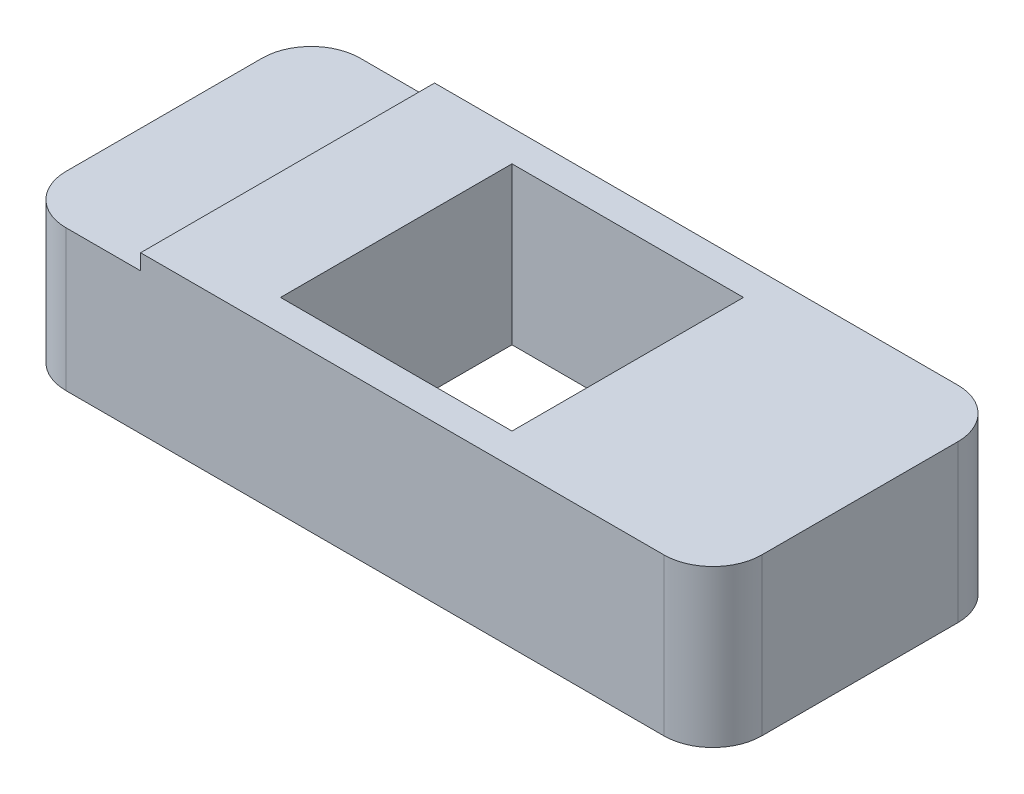
ISO-10303-21;
HEADER;
FILE_DESCRIPTION(('STEP AP214'),'2;1');
FILE_NAME('part.step','',(''),(''),'','','');
FILE_SCHEMA(('AUTOMOTIVE_DESIGN { 1 0 10303 214 1 1 1 1 }'));
ENDSEC;
DATA;
#1=APPLICATION_CONTEXT('core data for automotive mechanical design processes');
#2=APPLICATION_PROTOCOL_DEFINITION('international standard','automotive_design',2000,#1);
#3=PRODUCT_CONTEXT('',#1,'mechanical');
#4=PRODUCT('Part','Part','',(#3));
#5=PRODUCT_RELATED_PRODUCT_CATEGORY('part','',(#4));
#6=PRODUCT_DEFINITION_FORMATION('','',#4);
#7=PRODUCT_DEFINITION_CONTEXT('part definition',#1,'design');
#8=PRODUCT_DEFINITION('design','',#6,#7);
#9=PRODUCT_DEFINITION_SHAPE('','',#8);
#10=(LENGTH_UNIT() NAMED_UNIT(*) SI_UNIT(.MILLI.,.METRE.));
#11=(NAMED_UNIT(*) PLANE_ANGLE_UNIT() SI_UNIT($,.RADIAN.));
#12=(NAMED_UNIT(*) SI_UNIT($,.STERADIAN.) SOLID_ANGLE_UNIT());
#13=UNCERTAINTY_MEASURE_WITH_UNIT(LENGTH_MEASURE(1.E-05),#10,'distance_accuracy_value','');
#14=(GEOMETRIC_REPRESENTATION_CONTEXT(3) GLOBAL_UNCERTAINTY_ASSIGNED_CONTEXT((#13)) GLOBAL_UNIT_ASSIGNED_CONTEXT((#10,
#11,#12)) REPRESENTATION_CONTEXT('',''));
#15=CARTESIAN_POINT('',(0.,0.,0.));
#16=DIRECTION('',(0.,0.,1.));
#17=DIRECTION('',(1.,0.,0.));
#18=AXIS2_PLACEMENT_3D('',#15,#16,#17);
#19=CARTESIAN_POINT('',(-22.5425,-10.16,9.525));
#20=DIRECTION('',(0.,0.,1.));
#21=DIRECTION('',(1.,0.,0.));
#22=AXIS2_PLACEMENT_3D('',#19,#20,#21);
#23=PLANE('',#22);
#24=DIRECTION('',(1.,0.,0.));
#25=VECTOR('',#24,1.);
#26=CARTESIAN_POINT('',(-22.5425,0.,9.525));
#27=LINE('',#26,#25);
#28=CARTESIAN_POINT('',(-14.5425,0.,9.525));
#29=VERTEX_POINT('',#28);
#30=CARTESIAN_POINT('',(19.3675,0.,9.525));
#31=VERTEX_POINT('',#30);
#32=EDGE_CURVE('E369',#29,#31,#27,.T.);
#33=ORIENTED_EDGE('',*,*,#32,.F.);
#34=DIRECTION('',(0.,-1.,0.));
#35=VECTOR('',#34,1.);
#36=CARTESIAN_POINT('',(-14.5425,62.4848147177576,9.525));
#37=LINE('',#36,#35);
#38=CARTESIAN_POINT('',(-14.5425,-1.016,9.525));
#39=VERTEX_POINT('',#38);
#40=EDGE_CURVE('E317',#29,#39,#37,.T.);
#41=ORIENTED_EDGE('',*,*,#40,.T.);
#42=DIRECTION('',(1.,0.,0.));
#43=VECTOR('',#42,1.);
#44=CARTESIAN_POINT('',(-22.5425,-1.016,9.525));
#45=LINE('',#44,#43);
#46=CARTESIAN_POINT('',(-19.3675,-1.016,9.525));
#47=VERTEX_POINT('',#46);
#48=EDGE_CURVE('E255',#47,#39,#45,.T.);
#49=ORIENTED_EDGE('',*,*,#48,.F.);
#50=DIRECTION('',(0.,1.,0.));
#51=VECTOR('',#50,1.);
#52=CARTESIAN_POINT('',(-19.3675,-10.16,9.525));
#53=LINE('',#52,#51);
#54=CARTESIAN_POINT('',(-19.3675,-10.16,9.525));
#55=VERTEX_POINT('',#54);
#56=EDGE_CURVE('E378',#47,#55,#53,.F.);
#57=ORIENTED_EDGE('',*,*,#56,.T.);
#58=DIRECTION('',(1.,0.,0.));
#59=VECTOR('',#58,1.);
#60=CARTESIAN_POINT('',(-22.5425,-10.16,9.525));
#61=LINE('',#60,#59);
#62=CARTESIAN_POINT('',(19.3675,-10.16,9.525));
#63=VERTEX_POINT('',#62);
#64=EDGE_CURVE('E375',#55,#63,#61,.T.);
#65=ORIENTED_EDGE('',*,*,#64,.T.);
#66=DIRECTION('',(0.,1.,0.));
#67=VECTOR('',#66,1.);
#68=CARTESIAN_POINT('',(19.3675,-10.16,9.525));
#69=LINE('',#68,#67);
#70=EDGE_CURVE('E386',#63,#31,#69,.T.);
#71=ORIENTED_EDGE('',*,*,#70,.T.);
#72=EDGE_LOOP('',(#33,#41,#49,#57,#65,#71));
#73=FACE_BOUND('',#72,.T.);
#74=ADVANCED_FACE('F34',(#73),#23,.T.);
#75=CARTESIAN_POINT('',(-22.5425,-10.16,-9.525));
#76=DIRECTION('',(0.,0.,-1.));
#77=DIRECTION('',(-1.,0.,0.));
#78=AXIS2_PLACEMENT_3D('',#75,#76,#77);
#79=PLANE('',#78);
#80=DIRECTION('',(-1.,0.,0.));
#81=VECTOR('',#80,1.);
#82=CARTESIAN_POINT('',(-22.5425,-1.016,-9.525));
#83=LINE('',#82,#81);
#84=CARTESIAN_POINT('',(-14.5425,-1.016,-9.525));
#85=VERTEX_POINT('',#84);
#86=CARTESIAN_POINT('',(-19.3675,-1.016,-9.525));
#87=VERTEX_POINT('',#86);
#88=EDGE_CURVE('E322',#85,#87,#83,.T.);
#89=ORIENTED_EDGE('',*,*,#88,.F.);
#90=DIRECTION('',(0.,-1.,0.));
#91=VECTOR('',#90,1.);
#92=CARTESIAN_POINT('',(-14.5425,62.4848147177576,-9.525));
#93=LINE('',#92,#91);
#94=CARTESIAN_POINT('',(-14.5425,0.,-9.525));
#95=VERTEX_POINT('',#94);
#96=EDGE_CURVE('E311',#95,#85,#93,.T.);
#97=ORIENTED_EDGE('',*,*,#96,.F.);
#98=DIRECTION('',(-1.,0.,0.));
#99=VECTOR('',#98,1.);
#100=CARTESIAN_POINT('',(-22.5425,0.,-9.525));
#101=LINE('',#100,#99);
#102=CARTESIAN_POINT('',(19.3675,0.,-9.525));
#103=VERTEX_POINT('',#102);
#104=EDGE_CURVE('E381',#103,#95,#101,.T.);
#105=ORIENTED_EDGE('',*,*,#104,.F.);
#106=DIRECTION('',(0.,1.,0.));
#107=VECTOR('',#106,1.);
#108=CARTESIAN_POINT('',(19.3675,-10.16,-9.525));
#109=LINE('',#108,#107);
#110=CARTESIAN_POINT('',(19.3675,-10.16,-9.525));
#111=VERTEX_POINT('',#110);
#112=EDGE_CURVE('E409',#103,#111,#109,.F.);
#113=ORIENTED_EDGE('',*,*,#112,.T.);
#114=DIRECTION('',(-1.,0.,0.));
#115=VECTOR('',#114,1.);
#116=CARTESIAN_POINT('',(-22.5425,-10.16,-9.525));
#117=LINE('',#116,#115);
#118=CARTESIAN_POINT('',(-19.3675,-10.16,-9.525));
#119=VERTEX_POINT('',#118);
#120=EDGE_CURVE('E368',#111,#119,#117,.T.);
#121=ORIENTED_EDGE('',*,*,#120,.T.);
#122=DIRECTION('',(0.,1.,0.));
#123=VECTOR('',#122,1.);
#124=CARTESIAN_POINT('',(-19.3675,-10.16,-9.525));
#125=LINE('',#124,#123);
#126=EDGE_CURVE('E406',#119,#87,#125,.T.);
#127=ORIENTED_EDGE('',*,*,#126,.T.);
#128=EDGE_LOOP('',(#89,#97,#105,#113,#121,#127));
#129=FACE_BOUND('',#128,.T.);
#130=ADVANCED_FACE('F425',(#129),#79,.T.);
#131=CARTESIAN_POINT('',(0.,0.,0.));
#132=DIRECTION('',(0.,-1.,0.));
#133=DIRECTION('',(0.,0.,-1.));
#134=AXIS2_PLACEMENT_3D('',#131,#132,#133);
#135=PLANE('',#134);
#136=DIRECTION('',(-1.,0.,0.));
#137=VECTOR('',#136,1.);
#138=CARTESIAN_POINT('',(-7.5,0.,-7.5));
#139=LINE('',#138,#137);
#140=CARTESIAN_POINT('',(7.5,0.,-7.5));
#141=VERTEX_POINT('',#140);
#142=CARTESIAN_POINT('',(-7.5,0.,-7.5));
#143=VERTEX_POINT('',#142);
#144=EDGE_CURVE('E348',#141,#143,#139,.T.);
#145=ORIENTED_EDGE('',*,*,#144,.F.);
#146=DIRECTION('',(0.,0.,-1.));
#147=VECTOR('',#146,1.);
#148=CARTESIAN_POINT('',(7.5,0.,7.5));
#149=LINE('',#148,#147);
#150=CARTESIAN_POINT('',(7.5,0.,7.5));
#151=VERTEX_POINT('',#150);
#152=EDGE_CURVE('E319',#151,#141,#149,.T.);
#153=ORIENTED_EDGE('',*,*,#152,.F.);
#154=DIRECTION('',(1.,0.,0.));
#155=VECTOR('',#154,1.);
#156=CARTESIAN_POINT('',(-7.5,0.,7.5));
#157=LINE('',#156,#155);
#158=CARTESIAN_POINT('',(-7.5,0.,7.5));
#159=VERTEX_POINT('',#158);
#160=EDGE_CURVE('E337',#159,#151,#157,.T.);
#161=ORIENTED_EDGE('',*,*,#160,.F.);
#162=DIRECTION('',(0.,0.,1.));
#163=VECTOR('',#162,1.);
#164=CARTESIAN_POINT('',(-7.5,0.,7.5));
#165=LINE('',#164,#163);
#166=EDGE_CURVE('E351',#143,#159,#165,.T.);
#167=ORIENTED_EDGE('',*,*,#166,.F.);
#168=EDGE_LOOP('',(#145,#153,#161,#167));
#169=FACE_BOUND('',#168,.T.);
#170=DIRECTION('',(0.,0.,1.));
#171=VECTOR('',#170,1.);
#172=CARTESIAN_POINT('',(-14.5425,0.,9.525));
#173=LINE('',#172,#171);
#174=EDGE_CURVE('E312',#95,#29,#173,.T.);
#175=ORIENTED_EDGE('',*,*,#174,.T.);
#176=ORIENTED_EDGE('',*,*,#32,.T.);
#177=CARTESIAN_POINT('',(19.3675,0.,6.35));
#178=DIRECTION('',(0.,-1.,0.));
#179=DIRECTION('',(0.,0.,-1.));
#180=AXIS2_PLACEMENT_3D('',#177,#178,#179);
#181=CIRCLE('',#180,3.175);
#182=CARTESIAN_POINT('',(22.5425,0.,6.35));
#183=VERTEX_POINT('',#182);
#184=EDGE_CURVE('E391',#31,#183,#181,.F.);
#185=ORIENTED_EDGE('',*,*,#184,.T.);
#186=DIRECTION('',(0.,0.,-1.));
#187=VECTOR('',#186,1.);
#188=CARTESIAN_POINT('',(22.5425,0.,9.525));
#189=LINE('',#188,#187);
#190=CARTESIAN_POINT('',(22.5425,0.,-6.34999999999999));
#191=VERTEX_POINT('',#190);
#192=EDGE_CURVE('E358',#183,#191,#189,.T.);
#193=ORIENTED_EDGE('',*,*,#192,.T.);
#194=CARTESIAN_POINT('',(19.3675,0.,-6.35));
#195=DIRECTION('',(0.,-1.,0.));
#196=DIRECTION('',(0.,0.,-1.));
#197=AXIS2_PLACEMENT_3D('',#194,#195,#196);
#198=CIRCLE('',#197,3.175);
#199=EDGE_CURVE('E389',#191,#103,#198,.F.);
#200=ORIENTED_EDGE('',*,*,#199,.T.);
#201=ORIENTED_EDGE('',*,*,#104,.T.);
#202=EDGE_LOOP('',(#175,#176,#185,#193,#200,#201));
#203=FACE_BOUND('',#202,.T.);
#204=ADVANCED_FACE('F436',(#169,#203),#135,.F.);
#205=CARTESIAN_POINT('',(22.5425,-10.16,9.525));
#206=DIRECTION('',(1.,0.,0.));
#207=DIRECTION('',(0.,0.,-1.));
#208=AXIS2_PLACEMENT_3D('',#205,#206,#207);
#209=PLANE('',#208);
#210=ORIENTED_EDGE('',*,*,#192,.F.);
#211=DIRECTION('',(0.,1.,0.));
#212=VECTOR('',#211,1.);
#213=CARTESIAN_POINT('',(22.5425,-10.16,6.35));
#214=LINE('',#213,#212);
#215=CARTESIAN_POINT('',(22.5425,-10.16,6.35));
#216=VERTEX_POINT('',#215);
#217=EDGE_CURVE('E396',#183,#216,#214,.F.);
#218=ORIENTED_EDGE('',*,*,#217,.T.);
#219=DIRECTION('',(0.,0.,-1.));
#220=VECTOR('',#219,1.);
#221=CARTESIAN_POINT('',(22.5425,-10.16,9.525));
#222=LINE('',#221,#220);
#223=CARTESIAN_POINT('',(22.5425,-10.16,-6.34999999999999));
#224=VERTEX_POINT('',#223);
#225=EDGE_CURVE('E365',#216,#224,#222,.T.);
#226=ORIENTED_EDGE('',*,*,#225,.T.);
#227=DIRECTION('',(0.,1.,0.));
#228=VECTOR('',#227,1.);
#229=CARTESIAN_POINT('',(22.5425,-10.16,-6.35));
#230=LINE('',#229,#228);
#231=EDGE_CURVE('E393',#224,#191,#230,.T.);
#232=ORIENTED_EDGE('',*,*,#231,.T.);
#233=EDGE_LOOP('',(#210,#218,#226,#232));
#234=FACE_BOUND('',#233,.T.);
#235=ADVANCED_FACE('F444',(#234),#209,.T.);
#236=CARTESIAN_POINT('',(-22.5425,-10.16,9.525));
#237=DIRECTION('',(-1.,0.,0.));
#238=DIRECTION('',(0.,0.,1.));
#239=AXIS2_PLACEMENT_3D('',#236,#237,#238);
#240=PLANE('',#239);
#241=DIRECTION('',(0.,0.,1.));
#242=VECTOR('',#241,1.);
#243=CARTESIAN_POINT('',(-22.5425,-1.016,9.525));
#244=LINE('',#243,#242);
#245=CARTESIAN_POINT('',(-22.5425,-1.016,-6.34999999999999));
#246=VERTEX_POINT('',#245);
#247=CARTESIAN_POINT('',(-22.5425,-1.016,6.35));
#248=VERTEX_POINT('',#247);
#249=EDGE_CURVE('E328',#246,#248,#244,.T.);
#250=ORIENTED_EDGE('',*,*,#249,.F.);
#251=DIRECTION('',(0.,1.,0.));
#252=VECTOR('',#251,1.);
#253=CARTESIAN_POINT('',(-22.5425,-10.16,-6.35));
#254=LINE('',#253,#252);
#255=CARTESIAN_POINT('',(-22.5425,-10.16,-6.34999999999999));
#256=VERTEX_POINT('',#255);
#257=EDGE_CURVE('E42',#246,#256,#254,.F.);
#258=ORIENTED_EDGE('',*,*,#257,.T.);
#259=DIRECTION('',(0.,0.,1.));
#260=VECTOR('',#259,1.);
#261=CARTESIAN_POINT('',(-22.5425,-10.16,9.525));
#262=LINE('',#261,#260);
#263=CARTESIAN_POINT('',(-22.5425,-10.16,6.35));
#264=VERTEX_POINT('',#263);
#265=EDGE_CURVE('E372',#256,#264,#262,.T.);
#266=ORIENTED_EDGE('',*,*,#265,.T.);
#267=DIRECTION('',(0.,1.,0.));
#268=VECTOR('',#267,1.);
#269=CARTESIAN_POINT('',(-22.5425,-10.16,6.35));
#270=LINE('',#269,#268);
#271=EDGE_CURVE('E11',#264,#248,#270,.T.);
#272=ORIENTED_EDGE('',*,*,#271,.T.);
#273=EDGE_LOOP('',(#250,#258,#266,#272));
#274=FACE_BOUND('',#273,.T.);
#275=ADVANCED_FACE('F413',(#274),#240,.T.);
#276=CARTESIAN_POINT('',(0.,-10.16,0.));
#277=DIRECTION('',(0.,-1.,0.));
#278=DIRECTION('',(0.,0.,-1.));
#279=AXIS2_PLACEMENT_3D('',#276,#277,#278);
#280=PLANE('',#279);
#281=DIRECTION('',(0.,0.,-1.));
#282=VECTOR('',#281,1.);
#283=CARTESIAN_POINT('',(-21.216,-10.16,3.66617420935412));
#284=LINE('',#283,#282);
#285=CARTESIAN_POINT('',(-21.216,-10.16,3.66617420935412));
#286=VERTEX_POINT('',#285);
#287=CARTESIAN_POINT('',(-21.216,-10.16,-3.66617420935412));
#288=VERTEX_POINT('',#287);
#289=EDGE_CURVE('E49',#286,#288,#284,.T.);
#290=ORIENTED_EDGE('',*,*,#289,.F.);
#291=DIRECTION('',(-0.866025403784439,0.,-0.5));
#292=VECTOR('',#291,1.);
#293=CARTESIAN_POINT('',(-14.866,-10.16,7.33234841870825));
#294=LINE('',#293,#292);
#295=CARTESIAN_POINT('',(-14.866,-10.16,7.33234841870825));
#296=VERTEX_POINT('',#295);
#297=EDGE_CURVE('E228',#296,#286,#294,.T.);
#298=ORIENTED_EDGE('',*,*,#297,.F.);
#299=DIRECTION('',(-0.866025403784439,0.,0.5));
#300=VECTOR('',#299,1.);
#301=CARTESIAN_POINT('',(-8.516,-10.16,3.66617420935412));
#302=LINE('',#301,#300);
#303=CARTESIAN_POINT('',(-8.516,-10.16,3.66617420935412));
#304=VERTEX_POINT('',#303);
#305=EDGE_CURVE('E231',#304,#296,#302,.T.);
#306=ORIENTED_EDGE('',*,*,#305,.F.);
#307=DIRECTION('',(0.,0.,1.));
#308=VECTOR('',#307,1.);
#309=CARTESIAN_POINT('',(-8.516,-10.16,-3.66617420935412));
#310=LINE('',#309,#308);
#311=CARTESIAN_POINT('',(-8.516,-10.16,-3.66617420935412));
#312=VERTEX_POINT('',#311);
#313=EDGE_CURVE('E248',#312,#304,#310,.T.);
#314=ORIENTED_EDGE('',*,*,#313,.F.);
#315=DIRECTION('',(0.866025403784439,0.,0.5));
#316=VECTOR('',#315,1.);
#317=CARTESIAN_POINT('',(-14.866,-10.16,-7.33234841870824));
#318=LINE('',#317,#316);
#319=CARTESIAN_POINT('',(-14.866,-10.16,-7.33234841870824));
#320=VERTEX_POINT('',#319);
#321=EDGE_CURVE('E245',#320,#312,#318,.T.);
#322=ORIENTED_EDGE('',*,*,#321,.F.);
#323=DIRECTION('',(0.866025403784439,0.,-0.5));
#324=VECTOR('',#323,1.);
#325=CARTESIAN_POINT('',(-21.216,-10.16,-3.66617420935412));
#326=LINE('',#325,#324);
#327=EDGE_CURVE('E242',#288,#320,#326,.T.);
#328=ORIENTED_EDGE('',*,*,#327,.F.);
#329=EDGE_LOOP('',(#290,#298,#306,#314,#322,#328));
#330=FACE_BOUND('',#329,.T.);
#331=DIRECTION('',(0.,0.,-1.));
#332=VECTOR('',#331,1.);
#333=CARTESIAN_POINT('',(8.516,-10.16,3.66617420935412));
#334=LINE('',#333,#332);
#335=CARTESIAN_POINT('',(8.516,-10.16,3.66617420935412));
#336=VERTEX_POINT('',#335);
#337=CARTESIAN_POINT('',(8.516,-10.16,-3.66617420935413));
#338=VERTEX_POINT('',#337);
#339=EDGE_CURVE('E57',#336,#338,#334,.T.);
#340=ORIENTED_EDGE('',*,*,#339,.F.);
#341=DIRECTION('',(-0.866025403784439,0.,-0.5));
#342=VECTOR('',#341,1.);
#343=CARTESIAN_POINT('',(14.866,-10.16,7.33234841870825));
#344=LINE('',#343,#342);
#345=CARTESIAN_POINT('',(14.866,-10.16,7.33234841870825));
#346=VERTEX_POINT('',#345);
#347=EDGE_CURVE('E267',#346,#336,#344,.T.);
#348=ORIENTED_EDGE('',*,*,#347,.F.);
#349=DIRECTION('',(-0.866025403784439,0.,0.5));
#350=VECTOR('',#349,1.);
#351=CARTESIAN_POINT('',(21.216,-10.16,3.66617420935412));
#352=LINE('',#351,#350);
#353=CARTESIAN_POINT('',(21.216,-10.16,3.66617420935412));
#354=VERTEX_POINT('',#353);
#355=EDGE_CURVE('E293',#354,#346,#352,.T.);
#356=ORIENTED_EDGE('',*,*,#355,.F.);
#357=DIRECTION('',(0.,0.,1.));
#358=VECTOR('',#357,1.);
#359=CARTESIAN_POINT('',(21.216,-10.16,-3.66617420935413));
#360=LINE('',#359,#358);
#361=CARTESIAN_POINT('',(21.216,-10.16,-3.66617420935413));
#362=VERTEX_POINT('',#361);
#363=EDGE_CURVE('E290',#362,#354,#360,.T.);
#364=ORIENTED_EDGE('',*,*,#363,.F.);
#365=DIRECTION('',(0.866025403784439,0.,0.5));
#366=VECTOR('',#365,1.);
#367=CARTESIAN_POINT('',(14.866,-10.16,-7.33234841870825));
#368=LINE('',#367,#366);
#369=CARTESIAN_POINT('',(14.866,-10.16,-7.33234841870825));
#370=VERTEX_POINT('',#369);
#371=EDGE_CURVE('E287',#370,#362,#368,.T.);
#372=ORIENTED_EDGE('',*,*,#371,.F.);
#373=DIRECTION('',(0.866025403784439,0.,-0.5));
#374=VECTOR('',#373,1.);
#375=CARTESIAN_POINT('',(8.516,-10.16,-3.66617420935412));
#376=LINE('',#375,#374);
#377=EDGE_CURVE('E284',#338,#370,#376,.T.);
#378=ORIENTED_EDGE('',*,*,#377,.F.);
#379=EDGE_LOOP('',(#340,#348,#356,#364,#372,#378));
#380=FACE_BOUND('',#379,.T.);
#381=DIRECTION('',(0.,0.,-1.));
#382=VECTOR('',#381,1.);
#383=CARTESIAN_POINT('',(7.5,-10.16,7.5));
#384=LINE('',#383,#382);
#385=CARTESIAN_POINT('',(7.5,-10.16,7.5));
#386=VERTEX_POINT('',#385);
#387=CARTESIAN_POINT('',(7.5,-10.16,-7.5));
#388=VERTEX_POINT('',#387);
#389=EDGE_CURVE('E333',#386,#388,#384,.T.);
#390=ORIENTED_EDGE('',*,*,#389,.T.);
#391=DIRECTION('',(-1.,0.,0.));
#392=VECTOR('',#391,1.);
#393=CARTESIAN_POINT('',(-7.5,-10.16,-7.5));
#394=LINE('',#393,#392);
#395=CARTESIAN_POINT('',(-7.5,-10.16,-7.5));
#396=VERTEX_POINT('',#395);
#397=EDGE_CURVE('E336',#388,#396,#394,.T.);
#398=ORIENTED_EDGE('',*,*,#397,.T.);
#399=DIRECTION('',(0.,0.,1.));
#400=VECTOR('',#399,1.);
#401=CARTESIAN_POINT('',(-7.5,-10.16,7.5));
#402=LINE('',#401,#400);
#403=CARTESIAN_POINT('',(-7.5,-10.16,7.5));
#404=VERTEX_POINT('',#403);
#405=EDGE_CURVE('E340',#396,#404,#402,.T.);
#406=ORIENTED_EDGE('',*,*,#405,.T.);
#407=DIRECTION('',(1.,0.,0.));
#408=VECTOR('',#407,1.);
#409=CARTESIAN_POINT('',(-7.5,-10.16,7.5));
#410=LINE('',#409,#408);
#411=EDGE_CURVE('E343',#404,#386,#410,.T.);
#412=ORIENTED_EDGE('',*,*,#411,.T.);
#413=EDGE_LOOP('',(#390,#398,#406,#412));
#414=FACE_BOUND('',#413,.T.);
#415=ORIENTED_EDGE('',*,*,#225,.F.);
#416=CARTESIAN_POINT('',(19.3675,-10.16,6.35));
#417=DIRECTION('',(0.,-1.,0.));
#418=DIRECTION('',(0.,0.,-1.));
#419=AXIS2_PLACEMENT_3D('',#416,#417,#418);
#420=CIRCLE('',#419,3.175);
#421=EDGE_CURVE('E404',#216,#63,#420,.T.);
#422=ORIENTED_EDGE('',*,*,#421,.T.);
#423=ORIENTED_EDGE('',*,*,#64,.F.);
#424=CARTESIAN_POINT('',(-19.3675,-10.16,6.35));
#425=DIRECTION('',(0.,-1.,0.));
#426=DIRECTION('',(0.,0.,-1.));
#427=AXIS2_PLACEMENT_3D('',#424,#425,#426);
#428=CIRCLE('',#427,3.175);
#429=EDGE_CURVE('E400',#55,#264,#428,.T.);
#430=ORIENTED_EDGE('',*,*,#429,.T.);
#431=ORIENTED_EDGE('',*,*,#265,.F.);
#432=CARTESIAN_POINT('',(-19.3675,-10.16,-6.35));
#433=DIRECTION('',(0.,-1.,0.));
#434=DIRECTION('',(0.,0.,-1.));
#435=AXIS2_PLACEMENT_3D('',#432,#433,#434);
#436=CIRCLE('',#435,3.175);
#437=EDGE_CURVE('E398',#256,#119,#436,.T.);
#438=ORIENTED_EDGE('',*,*,#437,.T.);
#439=ORIENTED_EDGE('',*,*,#120,.F.);
#440=CARTESIAN_POINT('',(19.3675,-10.16,-6.35));
#441=DIRECTION('',(0.,-1.,0.));
#442=DIRECTION('',(0.,0.,-1.));
#443=AXIS2_PLACEMENT_3D('',#440,#441,#442);
#444=CIRCLE('',#443,3.175);
#445=EDGE_CURVE('E402',#111,#224,#444,.T.);
#446=ORIENTED_EDGE('',*,*,#445,.T.);
#447=EDGE_LOOP('',(#415,#422,#423,#430,#431,#438,#439,#446));
#448=FACE_BOUND('',#447,.T.);
#449=ADVANCED_FACE('F419',(#330,#380,#414,#448),#280,.T.);
#450=CARTESIAN_POINT('',(7.5,-10.16,7.5));
#451=DIRECTION('',(1.,0.,0.));
#452=DIRECTION('',(0.,0.,-1.));
#453=AXIS2_PLACEMENT_3D('',#450,#451,#452);
#454=PLANE('',#453);
#455=ORIENTED_EDGE('',*,*,#152,.T.);
#456=DIRECTION('',(0.,1.,0.));
#457=VECTOR('',#456,1.);
#458=CARTESIAN_POINT('',(7.5,-10.16,-7.5));
#459=LINE('',#458,#457);
#460=EDGE_CURVE('E346',#388,#141,#459,.T.);
#461=ORIENTED_EDGE('',*,*,#460,.F.);
#462=ORIENTED_EDGE('',*,*,#389,.F.);
#463=DIRECTION('',(0.,1.,0.));
#464=VECTOR('',#463,1.);
#465=CARTESIAN_POINT('',(7.5,-10.16,7.5));
#466=LINE('',#465,#464);
#467=EDGE_CURVE('E356',#386,#151,#466,.T.);
#468=ORIENTED_EDGE('',*,*,#467,.T.);
#469=EDGE_LOOP('',(#455,#461,#462,#468));
#470=FACE_BOUND('',#469,.T.);
#471=ADVANCED_FACE('F490',(#470),#454,.F.);
#472=CARTESIAN_POINT('',(-7.5,-10.16,7.5));
#473=DIRECTION('',(0.,0.,1.));
#474=DIRECTION('',(1.,0.,0.));
#475=AXIS2_PLACEMENT_3D('',#472,#473,#474);
#476=PLANE('',#475);
#477=ORIENTED_EDGE('',*,*,#160,.T.);
#478=ORIENTED_EDGE('',*,*,#467,.F.);
#479=ORIENTED_EDGE('',*,*,#411,.F.);
#480=DIRECTION('',(0.,1.,0.));
#481=VECTOR('',#480,1.);
#482=CARTESIAN_POINT('',(-7.5,-10.16,7.5));
#483=LINE('',#482,#481);
#484=EDGE_CURVE('E359',#404,#159,#483,.T.);
#485=ORIENTED_EDGE('',*,*,#484,.T.);
#486=EDGE_LOOP('',(#477,#478,#479,#485));
#487=FACE_BOUND('',#486,.T.);
#488=ADVANCED_FACE('F485',(#487),#476,.F.);
#489=CARTESIAN_POINT('',(-7.5,-10.16,7.5));
#490=DIRECTION('',(-1.,0.,0.));
#491=DIRECTION('',(0.,0.,1.));
#492=AXIS2_PLACEMENT_3D('',#489,#490,#491);
#493=PLANE('',#492);
#494=ORIENTED_EDGE('',*,*,#166,.T.);
#495=ORIENTED_EDGE('',*,*,#484,.F.);
#496=ORIENTED_EDGE('',*,*,#405,.F.);
#497=DIRECTION('',(0.,1.,0.));
#498=VECTOR('',#497,1.);
#499=CARTESIAN_POINT('',(-7.5,-10.16,-7.5));
#500=LINE('',#499,#498);
#501=EDGE_CURVE('E361',#396,#143,#500,.T.);
#502=ORIENTED_EDGE('',*,*,#501,.T.);
#503=EDGE_LOOP('',(#494,#495,#496,#502));
#504=FACE_BOUND('',#503,.T.);
#505=ADVANCED_FACE('F479',(#504),#493,.F.);
#506=CARTESIAN_POINT('',(-7.5,-10.16,-7.5));
#507=DIRECTION('',(0.,0.,-1.));
#508=DIRECTION('',(-1.,0.,0.));
#509=AXIS2_PLACEMENT_3D('',#506,#507,#508);
#510=PLANE('',#509);
#511=ORIENTED_EDGE('',*,*,#144,.T.);
#512=ORIENTED_EDGE('',*,*,#501,.F.);
#513=ORIENTED_EDGE('',*,*,#397,.F.);
#514=ORIENTED_EDGE('',*,*,#460,.T.);
#515=EDGE_LOOP('',(#511,#512,#513,#514));
#516=FACE_BOUND('',#515,.T.);
#517=ADVANCED_FACE('F475',(#516),#510,.F.);
#518=CARTESIAN_POINT('',(19.3675,-10.16,6.35));
#519=DIRECTION('',(0.,1.,0.));
#520=DIRECTION('',(0.,0.,1.));
#521=AXIS2_PLACEMENT_3D('',#518,#519,#520);
#522=CYLINDRICAL_SURFACE('',#521,3.175);
#523=ORIENTED_EDGE('',*,*,#421,.F.);
#524=ORIENTED_EDGE('',*,*,#217,.F.);
#525=ORIENTED_EDGE('',*,*,#184,.F.);
#526=ORIENTED_EDGE('',*,*,#70,.F.);
#527=EDGE_LOOP('',(#523,#524,#525,#526));
#528=FACE_BOUND('',#527,.T.);
#529=ADVANCED_FACE('F449',(#528),#522,.T.);
#530=CARTESIAN_POINT('',(19.3675,-10.16,-6.35));
#531=DIRECTION('',(0.,1.,0.));
#532=DIRECTION('',(0.,0.,1.));
#533=AXIS2_PLACEMENT_3D('',#530,#531,#532);
#534=CYLINDRICAL_SURFACE('',#533,3.175);
#535=ORIENTED_EDGE('',*,*,#445,.F.);
#536=ORIENTED_EDGE('',*,*,#112,.F.);
#537=ORIENTED_EDGE('',*,*,#199,.F.);
#538=ORIENTED_EDGE('',*,*,#231,.F.);
#539=EDGE_LOOP('',(#535,#536,#537,#538));
#540=FACE_BOUND('',#539,.T.);
#541=ADVANCED_FACE('F442',(#540),#534,.T.);
#542=CARTESIAN_POINT('',(-19.3675,-10.16,6.35));
#543=DIRECTION('',(0.,1.,0.));
#544=DIRECTION('',(0.,0.,1.));
#545=AXIS2_PLACEMENT_3D('',#542,#543,#544);
#546=CYLINDRICAL_SURFACE('',#545,3.175);
#547=CARTESIAN_POINT('',(-19.3675,-1.016,6.35));
#548=DIRECTION('',(0.,-1.,0.));
#549=DIRECTION('',(0.,0.,-1.));
#550=AXIS2_PLACEMENT_3D('',#547,#548,#549);
#551=CIRCLE('',#550,3.175);
#552=EDGE_CURVE('E314',#248,#47,#551,.F.);
#553=ORIENTED_EDGE('',*,*,#552,.F.);
#554=ORIENTED_EDGE('',*,*,#271,.F.);
#555=ORIENTED_EDGE('',*,*,#429,.F.);
#556=ORIENTED_EDGE('',*,*,#56,.F.);
#557=EDGE_LOOP('',(#553,#554,#555,#556));
#558=FACE_BOUND('',#557,.T.);
#559=ADVANCED_FACE('F454',(#558),#546,.T.);
#560=CARTESIAN_POINT('',(-19.3675,-10.16,-6.35));
#561=DIRECTION('',(0.,1.,0.));
#562=DIRECTION('',(0.,0.,1.));
#563=AXIS2_PLACEMENT_3D('',#560,#561,#562);
#564=CYLINDRICAL_SURFACE('',#563,3.175);
#565=CARTESIAN_POINT('',(-19.3675,-1.016,-6.35));
#566=DIRECTION('',(0.,-1.,0.));
#567=DIRECTION('',(0.,0.,-1.));
#568=AXIS2_PLACEMENT_3D('',#565,#566,#567);
#569=CIRCLE('',#568,3.175);
#570=EDGE_CURVE('E325',#87,#246,#569,.F.);
#571=ORIENTED_EDGE('',*,*,#570,.F.);
#572=ORIENTED_EDGE('',*,*,#126,.F.);
#573=ORIENTED_EDGE('',*,*,#437,.F.);
#574=ORIENTED_EDGE('',*,*,#257,.F.);
#575=EDGE_LOOP('',(#571,#572,#573,#574));
#576=FACE_BOUND('',#575,.T.);
#577=ADVANCED_FACE('F36',(#576),#564,.T.);
#578=CARTESIAN_POINT('',(-14.5425,62.4848147177576,9.525));
#579=DIRECTION('',(-1.,0.,0.));
#580=DIRECTION('',(0.,0.,1.));
#581=AXIS2_PLACEMENT_3D('',#578,#579,#580);
#582=PLANE('',#581);
#583=ORIENTED_EDGE('',*,*,#174,.F.);
#584=ORIENTED_EDGE('',*,*,#96,.T.);
#585=DIRECTION('',(0.,0.,1.));
#586=VECTOR('',#585,1.);
#587=CARTESIAN_POINT('',(-14.5425,-1.016,9.525));
#588=LINE('',#587,#586);
#589=EDGE_CURVE('E308',#85,#39,#588,.T.);
#590=ORIENTED_EDGE('',*,*,#589,.T.);
#591=ORIENTED_EDGE('',*,*,#40,.F.);
#592=EDGE_LOOP('',(#583,#584,#590,#591));
#593=FACE_BOUND('',#592,.T.);
#594=ADVANCED_FACE('F432',(#593),#582,.T.);
#595=CARTESIAN_POINT('',(0.,-1.016,0.));
#596=DIRECTION('',(0.,-1.,0.));
#597=DIRECTION('',(0.,0.,-1.));
#598=AXIS2_PLACEMENT_3D('',#595,#596,#597);
#599=PLANE('',#598);
#600=ORIENTED_EDGE('',*,*,#48,.T.);
#601=ORIENTED_EDGE('',*,*,#589,.F.);
#602=ORIENTED_EDGE('',*,*,#88,.T.);
#603=ORIENTED_EDGE('',*,*,#570,.T.);
#604=ORIENTED_EDGE('',*,*,#249,.T.);
#605=ORIENTED_EDGE('',*,*,#552,.T.);
#606=EDGE_LOOP('',(#600,#601,#602,#603,#604,#605));
#607=FACE_BOUND('',#606,.T.);
#608=ADVANCED_FACE('F428',(#607),#599,.F.);
#609=CARTESIAN_POINT('',(8.516,-1.524,3.66617420935412));
#610=DIRECTION('',(-1.,0.,0.));
#611=DIRECTION('',(0.,0.,1.));
#612=AXIS2_PLACEMENT_3D('',#609,#610,#611);
#613=PLANE('',#612);
#614=ORIENTED_EDGE('',*,*,#339,.T.);
#615=DIRECTION('',(0.,-1.,0.));
#616=VECTOR('',#615,1.);
#617=CARTESIAN_POINT('',(8.516,-1.524,-3.66617420935412));
#618=LINE('',#617,#616);
#619=CARTESIAN_POINT('',(8.516,-1.524,-3.66617420935412));
#620=VERTEX_POINT('',#619);
#621=EDGE_CURVE('E282',#620,#338,#618,.T.);
#622=ORIENTED_EDGE('',*,*,#621,.F.);
#623=DIRECTION('',(0.,0.,-1.));
#624=VECTOR('',#623,1.);
#625=CARTESIAN_POINT('',(8.516,-1.524,3.66617420935412));
#626=LINE('',#625,#624);
#627=CARTESIAN_POINT('',(8.516,-1.524,3.66617420935412));
#628=VERTEX_POINT('',#627);
#629=EDGE_CURVE('E263',#628,#620,#626,.T.);
#630=ORIENTED_EDGE('',*,*,#629,.F.);
#631=DIRECTION('',(0.,-1.,0.));
#632=VECTOR('',#631,1.);
#633=CARTESIAN_POINT('',(8.516,-1.524,3.66617420935412));
#634=LINE('',#633,#632);
#635=EDGE_CURVE('E243',#628,#336,#634,.T.);
#636=ORIENTED_EDGE('',*,*,#635,.T.);
#637=EDGE_LOOP('',(#614,#622,#630,#636));
#638=FACE_BOUND('',#637,.T.);
#639=ADVANCED_FACE('F554',(#638),#613,.F.);
#640=CARTESIAN_POINT('',(14.866,-1.524,7.33234841870825));
#641=DIRECTION('',(-0.5,0.,0.866025403784439));
#642=DIRECTION('',(0.866025403784439,0.,0.5));
#643=AXIS2_PLACEMENT_3D('',#640,#641,#642);
#644=PLANE('',#643);
#645=ORIENTED_EDGE('',*,*,#347,.T.);
#646=ORIENTED_EDGE('',*,*,#635,.F.);
#647=DIRECTION('',(-0.866025403784439,0.,-0.5));
#648=VECTOR('',#647,1.);
#649=CARTESIAN_POINT('',(14.866,-1.524,7.33234841870825));
#650=LINE('',#649,#648);
#651=CARTESIAN_POINT('',(14.866,-1.524,7.33234841870825));
#652=VERTEX_POINT('',#651);
#653=EDGE_CURVE('E279',#652,#628,#650,.T.);
#654=ORIENTED_EDGE('',*,*,#653,.F.);
#655=DIRECTION('',(0.,-1.,0.));
#656=VECTOR('',#655,1.);
#657=CARTESIAN_POINT('',(14.866,-1.524,7.33234841870825));
#658=LINE('',#657,#656);
#659=EDGE_CURVE('E299',#652,#346,#658,.T.);
#660=ORIENTED_EDGE('',*,*,#659,.T.);
#661=EDGE_LOOP('',(#645,#646,#654,#660));
#662=FACE_BOUND('',#661,.T.);
#663=ADVANCED_FACE('F568',(#662),#644,.F.);
#664=CARTESIAN_POINT('',(21.216,-1.524,3.66617420935412));
#665=DIRECTION('',(0.5,0.,0.866025403784439));
#666=DIRECTION('',(0.866025403784439,0.,-0.5));
#667=AXIS2_PLACEMENT_3D('',#664,#665,#666);
#668=PLANE('',#667);
#669=ORIENTED_EDGE('',*,*,#355,.T.);
#670=ORIENTED_EDGE('',*,*,#659,.F.);
#671=DIRECTION('',(-0.866025403784439,0.,0.5));
#672=VECTOR('',#671,1.);
#673=CARTESIAN_POINT('',(21.216,-1.524,3.66617420935412));
#674=LINE('',#673,#672);
#675=CARTESIAN_POINT('',(21.216,-1.524,3.66617420935412));
#676=VERTEX_POINT('',#675);
#677=EDGE_CURVE('E276',#676,#652,#674,.T.);
#678=ORIENTED_EDGE('',*,*,#677,.F.);
#679=DIRECTION('',(0.,-1.,0.));
#680=VECTOR('',#679,1.);
#681=CARTESIAN_POINT('',(21.216,-1.524,3.66617420935412));
#682=LINE('',#681,#680);
#683=EDGE_CURVE('E301',#676,#354,#682,.T.);
#684=ORIENTED_EDGE('',*,*,#683,.T.);
#685=EDGE_LOOP('',(#669,#670,#678,#684));
#686=FACE_BOUND('',#685,.T.);
#687=ADVANCED_FACE('F577',(#686),#668,.F.);
#688=CARTESIAN_POINT('',(21.216,-1.524,-3.66617420935413));
#689=DIRECTION('',(1.,0.,0.));
#690=DIRECTION('',(0.,0.,-1.));
#691=AXIS2_PLACEMENT_3D('',#688,#689,#690);
#692=PLANE('',#691);
#693=ORIENTED_EDGE('',*,*,#363,.T.);
#694=ORIENTED_EDGE('',*,*,#683,.F.);
#695=DIRECTION('',(0.,0.,1.));
#696=VECTOR('',#695,1.);
#697=CARTESIAN_POINT('',(21.216,-1.524,-3.66617420935413));
#698=LINE('',#697,#696);
#699=CARTESIAN_POINT('',(21.216,-1.524,-3.66617420935413));
#700=VERTEX_POINT('',#699);
#701=EDGE_CURVE('E273',#700,#676,#698,.T.);
#702=ORIENTED_EDGE('',*,*,#701,.F.);
#703=DIRECTION('',(0.,-1.,0.));
#704=VECTOR('',#703,1.);
#705=CARTESIAN_POINT('',(21.216,-1.524,-3.66617420935413));
#706=LINE('',#705,#704);
#707=EDGE_CURVE('E303',#700,#362,#706,.T.);
#708=ORIENTED_EDGE('',*,*,#707,.T.);
#709=EDGE_LOOP('',(#693,#694,#702,#708));
#710=FACE_BOUND('',#709,.T.);
#711=ADVANCED_FACE('F587',(#710),#692,.F.);
#712=CARTESIAN_POINT('',(14.866,-1.524,-7.33234841870825));
#713=DIRECTION('',(0.5,0.,-0.866025403784439));
#714=DIRECTION('',(-0.866025403784439,0.,-0.5));
#715=AXIS2_PLACEMENT_3D('',#712,#713,#714);
#716=PLANE('',#715);
#717=ORIENTED_EDGE('',*,*,#371,.T.);
#718=ORIENTED_EDGE('',*,*,#707,.F.);
#719=DIRECTION('',(0.866025403784439,0.,0.5));
#720=VECTOR('',#719,1.);
#721=CARTESIAN_POINT('',(14.866,-1.524,-7.33234841870825));
#722=LINE('',#721,#720);
#723=CARTESIAN_POINT('',(14.866,-1.524,-7.33234841870825));
#724=VERTEX_POINT('',#723);
#725=EDGE_CURVE('E270',#724,#700,#722,.T.);
#726=ORIENTED_EDGE('',*,*,#725,.F.);
#727=DIRECTION('',(0.,-1.,0.));
#728=VECTOR('',#727,1.);
#729=CARTESIAN_POINT('',(14.866,-1.524,-7.33234841870825));
#730=LINE('',#729,#728);
#731=EDGE_CURVE('E305',#724,#370,#730,.T.);
#732=ORIENTED_EDGE('',*,*,#731,.T.);
#733=EDGE_LOOP('',(#717,#718,#726,#732));
#734=FACE_BOUND('',#733,.T.);
#735=ADVANCED_FACE('F597',(#734),#716,.F.);
#736=CARTESIAN_POINT('',(8.516,-1.524,-3.66617420935412));
#737=DIRECTION('',(-0.5,0.,-0.866025403784439));
#738=DIRECTION('',(-0.866025403784439,0.,0.5));
#739=AXIS2_PLACEMENT_3D('',#736,#737,#738);
#740=PLANE('',#739);
#741=ORIENTED_EDGE('',*,*,#377,.T.);
#742=ORIENTED_EDGE('',*,*,#731,.F.);
#743=DIRECTION('',(0.866025403784439,0.,-0.5));
#744=VECTOR('',#743,1.);
#745=CARTESIAN_POINT('',(8.516,-1.524,-3.66617420935412));
#746=LINE('',#745,#744);
#747=EDGE_CURVE('E266',#620,#724,#746,.T.);
#748=ORIENTED_EDGE('',*,*,#747,.F.);
#749=ORIENTED_EDGE('',*,*,#621,.T.);
#750=EDGE_LOOP('',(#741,#742,#748,#749));
#751=FACE_BOUND('',#750,.T.);
#752=ADVANCED_FACE('F607',(#751),#740,.F.);
#753=CARTESIAN_POINT('',(0.,-1.524,0.));
#754=DIRECTION('',(0.,-1.,0.));
#755=DIRECTION('',(0.,0.,-1.));
#756=AXIS2_PLACEMENT_3D('',#753,#754,#755);
#757=PLANE('',#756);
#758=ORIENTED_EDGE('',*,*,#629,.T.);
#759=ORIENTED_EDGE('',*,*,#747,.T.);
#760=ORIENTED_EDGE('',*,*,#725,.T.);
#761=ORIENTED_EDGE('',*,*,#701,.T.);
#762=ORIENTED_EDGE('',*,*,#677,.T.);
#763=ORIENTED_EDGE('',*,*,#653,.T.);
#764=EDGE_LOOP('',(#758,#759,#760,#761,#762,#763));
#765=FACE_BOUND('',#764,.T.);
#766=ADVANCED_FACE('F617',(#765),#757,.T.);
#767=CARTESIAN_POINT('',(-21.216,-1.524,3.66617420935412));
#768=DIRECTION('',(-1.,0.,0.));
#769=DIRECTION('',(0.,0.,1.));
#770=AXIS2_PLACEMENT_3D('',#767,#768,#769);
#771=PLANE('',#770);
#772=ORIENTED_EDGE('',*,*,#289,.T.);
#773=DIRECTION('',(0.,-1.,0.));
#774=VECTOR('',#773,1.);
#775=CARTESIAN_POINT('',(-21.216,-1.524,-3.66617420935412));
#776=LINE('',#775,#774);
#777=CARTESIAN_POINT('',(-21.216,-1.524,-3.66617420935412));
#778=VERTEX_POINT('',#777);
#779=EDGE_CURVE('E205',#778,#288,#776,.T.);
#780=ORIENTED_EDGE('',*,*,#779,.F.);
#781=DIRECTION('',(0.,0.,-1.));
#782=VECTOR('',#781,1.);
#783=CARTESIAN_POINT('',(-21.216,-1.524,3.66617420935412));
#784=LINE('',#783,#782);
#785=CARTESIAN_POINT('',(-21.216,-1.524,3.66617420935412));
#786=VERTEX_POINT('',#785);
#787=EDGE_CURVE('E209',#786,#778,#784,.T.);
#788=ORIENTED_EDGE('',*,*,#787,.F.);
#789=DIRECTION('',(0.,-1.,0.));
#790=VECTOR('',#789,1.);
#791=CARTESIAN_POINT('',(-21.216,-1.524,3.66617420935412));
#792=LINE('',#791,#790);
#793=EDGE_CURVE('E253',#786,#286,#792,.T.);
#794=ORIENTED_EDGE('',*,*,#793,.T.);
#795=EDGE_LOOP('',(#772,#780,#788,#794));
#796=FACE_BOUND('',#795,.T.);
#797=ADVANCED_FACE('F207',(#796),#771,.F.);
#798=CARTESIAN_POINT('',(-14.866,-1.524,7.33234841870825));
#799=DIRECTION('',(-0.5,0.,0.866025403784439));
#800=DIRECTION('',(0.866025403784439,0.,0.5));
#801=AXIS2_PLACEMENT_3D('',#798,#799,#800);
#802=PLANE('',#801);
#803=ORIENTED_EDGE('',*,*,#297,.T.);
#804=ORIENTED_EDGE('',*,*,#793,.F.);
#805=DIRECTION('',(-0.866025403784439,0.,-0.5));
#806=VECTOR('',#805,1.);
#807=CARTESIAN_POINT('',(-14.866,-1.524,7.33234841870825));
#808=LINE('',#807,#806);
#809=CARTESIAN_POINT('',(-14.866,-1.524,7.33234841870825));
#810=VERTEX_POINT('',#809);
#811=EDGE_CURVE('E215',#810,#786,#808,.T.);
#812=ORIENTED_EDGE('',*,*,#811,.F.);
#813=DIRECTION('',(0.,-1.,0.));
#814=VECTOR('',#813,1.);
#815=CARTESIAN_POINT('',(-14.866,-1.524,7.33234841870825));
#816=LINE('',#815,#814);
#817=EDGE_CURVE('E256',#810,#296,#816,.T.);
#818=ORIENTED_EDGE('',*,*,#817,.T.);
#819=EDGE_LOOP('',(#803,#804,#812,#818));
#820=FACE_BOUND('',#819,.T.);
#821=ADVANCED_FACE('F636',(#820),#802,.F.);
#822=CARTESIAN_POINT('',(-8.516,-1.524,3.66617420935412));
#823=DIRECTION('',(0.5,0.,0.866025403784439));
#824=DIRECTION('',(0.866025403784439,0.,-0.5));
#825=AXIS2_PLACEMENT_3D('',#822,#823,#824);
#826=PLANE('',#825);
#827=ORIENTED_EDGE('',*,*,#305,.T.);
#828=ORIENTED_EDGE('',*,*,#817,.F.);
#829=DIRECTION('',(-0.866025403784439,0.,0.5));
#830=VECTOR('',#829,1.);
#831=CARTESIAN_POINT('',(-8.516,-1.524,3.66617420935412));
#832=LINE('',#831,#830);
#833=CARTESIAN_POINT('',(-8.516,-1.524,3.66617420935412));
#834=VERTEX_POINT('',#833);
#835=EDGE_CURVE('E238',#834,#810,#832,.T.);
#836=ORIENTED_EDGE('',*,*,#835,.F.);
#837=DIRECTION('',(0.,-1.,0.));
#838=VECTOR('',#837,1.);
#839=CARTESIAN_POINT('',(-8.516,-1.524,3.66617420935412));
#840=LINE('',#839,#838);
#841=EDGE_CURVE('E258',#834,#304,#840,.T.);
#842=ORIENTED_EDGE('',*,*,#841,.T.);
#843=EDGE_LOOP('',(#827,#828,#836,#842));
#844=FACE_BOUND('',#843,.T.);
#845=ADVANCED_FACE('F645',(#844),#826,.F.);
#846=CARTESIAN_POINT('',(-8.516,-1.524,-3.66617420935412));
#847=DIRECTION('',(1.,0.,0.));
#848=DIRECTION('',(0.,0.,-1.));
#849=AXIS2_PLACEMENT_3D('',#846,#847,#848);
#850=PLANE('',#849);
#851=ORIENTED_EDGE('',*,*,#313,.T.);
#852=ORIENTED_EDGE('',*,*,#841,.F.);
#853=DIRECTION('',(0.,0.,1.));
#854=VECTOR('',#853,1.);
#855=CARTESIAN_POINT('',(-8.516,-1.524,-3.66617420935412));
#856=LINE('',#855,#854);
#857=CARTESIAN_POINT('',(-8.516,-1.524,-3.66617420935412));
#858=VERTEX_POINT('',#857);
#859=EDGE_CURVE('E235',#858,#834,#856,.T.);
#860=ORIENTED_EDGE('',*,*,#859,.F.);
#861=DIRECTION('',(0.,-1.,0.));
#862=VECTOR('',#861,1.);
#863=CARTESIAN_POINT('',(-8.516,-1.524,-3.66617420935412));
#864=LINE('',#863,#862);
#865=EDGE_CURVE('E260',#858,#312,#864,.T.);
#866=ORIENTED_EDGE('',*,*,#865,.T.);
#867=EDGE_LOOP('',(#851,#852,#860,#866));
#868=FACE_BOUND('',#867,.T.);
#869=ADVANCED_FACE('F655',(#868),#850,.F.);
#870=CARTESIAN_POINT('',(-14.866,-1.524,-7.33234841870824));
#871=DIRECTION('',(0.5,0.,-0.866025403784439));
#872=DIRECTION('',(-0.866025403784439,0.,-0.5));
#873=AXIS2_PLACEMENT_3D('',#870,#871,#872);
#874=PLANE('',#873);
#875=ORIENTED_EDGE('',*,*,#321,.T.);
#876=ORIENTED_EDGE('',*,*,#865,.F.);
#877=DIRECTION('',(0.866025403784439,0.,0.5));
#878=VECTOR('',#877,1.);
#879=CARTESIAN_POINT('',(-14.866,-1.524,-7.33234841870824));
#880=LINE('',#879,#878);
#881=CARTESIAN_POINT('',(-14.866,-1.524,-7.33234841870824));
#882=VERTEX_POINT('',#881);
#883=EDGE_CURVE('E223',#882,#858,#880,.T.);
#884=ORIENTED_EDGE('',*,*,#883,.F.);
#885=DIRECTION('',(0.,-1.,0.));
#886=VECTOR('',#885,1.);
#887=CARTESIAN_POINT('',(-14.866,-1.524,-7.33234841870824));
#888=LINE('',#887,#886);
#889=EDGE_CURVE('E214',#882,#320,#888,.T.);
#890=ORIENTED_EDGE('',*,*,#889,.T.);
#891=EDGE_LOOP('',(#875,#876,#884,#890));
#892=FACE_BOUND('',#891,.T.);
#893=ADVANCED_FACE('F665',(#892),#874,.F.);
#894=CARTESIAN_POINT('',(-21.216,-1.524,-3.66617420935412));
#895=DIRECTION('',(-0.5,0.,-0.866025403784439));
#896=DIRECTION('',(-0.866025403784439,0.,0.5));
#897=AXIS2_PLACEMENT_3D('',#894,#895,#896);
#898=PLANE('',#897);
#899=ORIENTED_EDGE('',*,*,#327,.T.);
#900=ORIENTED_EDGE('',*,*,#889,.F.);
#901=DIRECTION('',(0.866025403784439,0.,-0.5));
#902=VECTOR('',#901,1.);
#903=CARTESIAN_POINT('',(-21.216,-1.524,-3.66617420935412));
#904=LINE('',#903,#902);
#905=EDGE_CURVE('E218',#778,#882,#904,.T.);
#906=ORIENTED_EDGE('',*,*,#905,.F.);
#907=ORIENTED_EDGE('',*,*,#779,.T.);
#908=EDGE_LOOP('',(#899,#900,#906,#907));
#909=FACE_BOUND('',#908,.T.);
#910=ADVANCED_FACE('F219',(#909),#898,.F.);
#911=CARTESIAN_POINT('',(0.,-1.524,0.));
#912=DIRECTION('',(0.,-1.,0.));
#913=DIRECTION('',(0.,0.,-1.));
#914=AXIS2_PLACEMENT_3D('',#911,#912,#913);
#915=PLANE('',#914);
#916=ORIENTED_EDGE('',*,*,#787,.T.);
#917=ORIENTED_EDGE('',*,*,#905,.T.);
#918=ORIENTED_EDGE('',*,*,#883,.T.);
#919=ORIENTED_EDGE('',*,*,#859,.T.);
#920=ORIENTED_EDGE('',*,*,#835,.T.);
#921=ORIENTED_EDGE('',*,*,#811,.T.);
#922=EDGE_LOOP('',(#916,#917,#918,#919,#920,#921));
#923=FACE_BOUND('',#922,.T.);
#924=ADVANCED_FACE('F225',(#923),#915,.T.);
#925=CLOSED_SHELL('',(#74,#130,#204,#235,#275,#449,#471,#488,#505,#517,#529,#541,#559,#577,#594,
#608,#639,#663,#687,#711,#735,#752,#766,#797,#821,#845,#869,#893,#910,#924));
#926=MANIFOLD_SOLID_BREP('B2',#925);
#927=ADVANCED_BREP_SHAPE_REPRESENTATION('',(#18,#926),#14);
#928=SHAPE_DEFINITION_REPRESENTATION(#9,#927);
ENDSEC;
END-ISO-10303-21;
